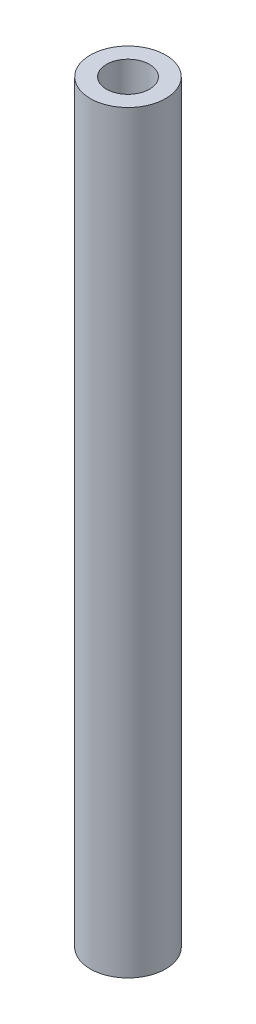
ISO-10303-21;
HEADER;
FILE_DESCRIPTION(('STEP AP214'),'2;1');
FILE_NAME('part.step','',(''),(''),'','','');
FILE_SCHEMA(('AUTOMOTIVE_DESIGN { 1 0 10303 214 1 1 1 1 }'));
ENDSEC;
DATA;
#1=APPLICATION_CONTEXT('core data for automotive mechanical design processes');
#2=APPLICATION_PROTOCOL_DEFINITION('international standard','automotive_design',2000,#1);
#3=PRODUCT_CONTEXT('',#1,'mechanical');
#4=PRODUCT('Part','Part','',(#3));
#5=PRODUCT_RELATED_PRODUCT_CATEGORY('part','',(#4));
#6=PRODUCT_DEFINITION_FORMATION('','',#4);
#7=PRODUCT_DEFINITION_CONTEXT('part definition',#1,'design');
#8=PRODUCT_DEFINITION('design','',#6,#7);
#9=PRODUCT_DEFINITION_SHAPE('','',#8);
#10=(LENGTH_UNIT() NAMED_UNIT(*) SI_UNIT(.MILLI.,.METRE.));
#11=(NAMED_UNIT(*) PLANE_ANGLE_UNIT() SI_UNIT($,.RADIAN.));
#12=(NAMED_UNIT(*) SI_UNIT($,.STERADIAN.) SOLID_ANGLE_UNIT());
#13=UNCERTAINTY_MEASURE_WITH_UNIT(LENGTH_MEASURE(1.E-05),#10,'distance_accuracy_value','');
#14=(GEOMETRIC_REPRESENTATION_CONTEXT(3) GLOBAL_UNCERTAINTY_ASSIGNED_CONTEXT((#13)) GLOBAL_UNIT_ASSIGNED_CONTEXT((#10,
#11,#12)) REPRESENTATION_CONTEXT('',''));
#15=CARTESIAN_POINT('',(0.,0.,0.));
#16=DIRECTION('',(0.,0.,1.));
#17=DIRECTION('',(1.,0.,0.));
#18=AXIS2_PLACEMENT_3D('',#15,#16,#17);
#19=CARTESIAN_POINT('',(0.,35.,0.));
#20=DIRECTION('',(0.,1.,0.));
#21=DIRECTION('',(0.,0.,1.));
#22=AXIS2_PLACEMENT_3D('',#19,#20,#21);
#23=PLANE('',#22);
#24=CARTESIAN_POINT('',(0.,35.,0.));
#25=DIRECTION('',(0.,1.,0.));
#26=DIRECTION('',(0.,0.,1.));
#27=AXIS2_PLACEMENT_3D('',#24,#25,#26);
#28=CIRCLE('',#27,1.75);
#29=CARTESIAN_POINT('',(0.,35.,1.75));
#30=VERTEX_POINT('',#29);
#31=EDGE_CURVE('E10',#30,#30,#28,.T.);
#32=ORIENTED_EDGE('',*,*,#31,.T.);
#33=EDGE_LOOP('',(#32));
#34=FACE_BOUND('',#33,.T.);
#35=CARTESIAN_POINT('',(0.,35.,0.));
#36=DIRECTION('',(0.,1.,0.));
#37=DIRECTION('',(0.,0.,1.));
#38=AXIS2_PLACEMENT_3D('',#35,#36,#37);
#39=CIRCLE('',#38,1.);
#40=CARTESIAN_POINT('',(0.,35.,1.));
#41=VERTEX_POINT('',#40);
#42=EDGE_CURVE('E54',#41,#41,#39,.T.);
#43=ORIENTED_EDGE('',*,*,#42,.F.);
#44=EDGE_LOOP('',(#43));
#45=FACE_BOUND('',#44,.T.);
#46=ADVANCED_FACE('F41',(#34,#45),#23,.T.);
#47=CARTESIAN_POINT('',(0.,0.,0.));
#48=DIRECTION('',(0.,1.,0.));
#49=DIRECTION('',(0.,0.,1.));
#50=AXIS2_PLACEMENT_3D('',#47,#48,#49);
#51=PLANE('',#50);
#52=CARTESIAN_POINT('',(0.,0.,0.));
#53=DIRECTION('',(0.,1.,0.));
#54=DIRECTION('',(0.,0.,1.));
#55=AXIS2_PLACEMENT_3D('',#52,#53,#54);
#56=CIRCLE('',#55,1.75);
#57=CARTESIAN_POINT('',(0.,0.,1.75));
#58=VERTEX_POINT('',#57);
#59=EDGE_CURVE('E45',#58,#58,#56,.T.);
#60=ORIENTED_EDGE('',*,*,#59,.F.);
#61=EDGE_LOOP('',(#60));
#62=FACE_BOUND('',#61,.T.);
#63=CARTESIAN_POINT('',(0.,0.,0.));
#64=DIRECTION('',(0.,1.,0.));
#65=DIRECTION('',(0.,0.,1.));
#66=AXIS2_PLACEMENT_3D('',#63,#64,#65);
#67=CIRCLE('',#66,1.);
#68=CARTESIAN_POINT('',(0.,0.,1.));
#69=VERTEX_POINT('',#68);
#70=EDGE_CURVE('E56',#69,#69,#67,.T.);
#71=ORIENTED_EDGE('',*,*,#70,.T.);
#72=EDGE_LOOP('',(#71));
#73=FACE_BOUND('',#72,.T.);
#74=ADVANCED_FACE('F68',(#62,#73),#51,.F.);
#75=CARTESIAN_POINT('',(0.,35.,0.));
#76=DIRECTION('',(0.,-1.,0.));
#77=DIRECTION('',(0.,0.,-1.));
#78=AXIS2_PLACEMENT_3D('',#75,#76,#77);
#79=CYLINDRICAL_SURFACE('',#78,1.75);
#80=ORIENTED_EDGE('',*,*,#31,.F.);
#81=EDGE_LOOP('',(#80));
#82=FACE_BOUND('',#81,.T.);
#83=ORIENTED_EDGE('',*,*,#59,.T.);
#84=EDGE_LOOP('',(#83));
#85=FACE_BOUND('',#84,.T.);
#86=ADVANCED_FACE('F43',(#82,#85),#79,.T.);
#87=CARTESIAN_POINT('',(0.,35.,0.));
#88=DIRECTION('',(0.,-1.,0.));
#89=DIRECTION('',(0.,0.,-1.));
#90=AXIS2_PLACEMENT_3D('',#87,#88,#89);
#91=CYLINDRICAL_SURFACE('',#90,1.);
#92=ORIENTED_EDGE('',*,*,#42,.T.);
#93=EDGE_LOOP('',(#92));
#94=FACE_BOUND('',#93,.T.);
#95=ORIENTED_EDGE('',*,*,#70,.F.);
#96=EDGE_LOOP('',(#95));
#97=FACE_BOUND('',#96,.T.);
#98=ADVANCED_FACE('F64',(#94,#97),#91,.F.);
#99=CLOSED_SHELL('',(#46,#74,#86,#98));
#100=MANIFOLD_SOLID_BREP('B2',#99);
#101=ADVANCED_BREP_SHAPE_REPRESENTATION('',(#18,#100),#14);
#102=SHAPE_DEFINITION_REPRESENTATION(#9,#101);
ENDSEC;
END-ISO-10303-21;
